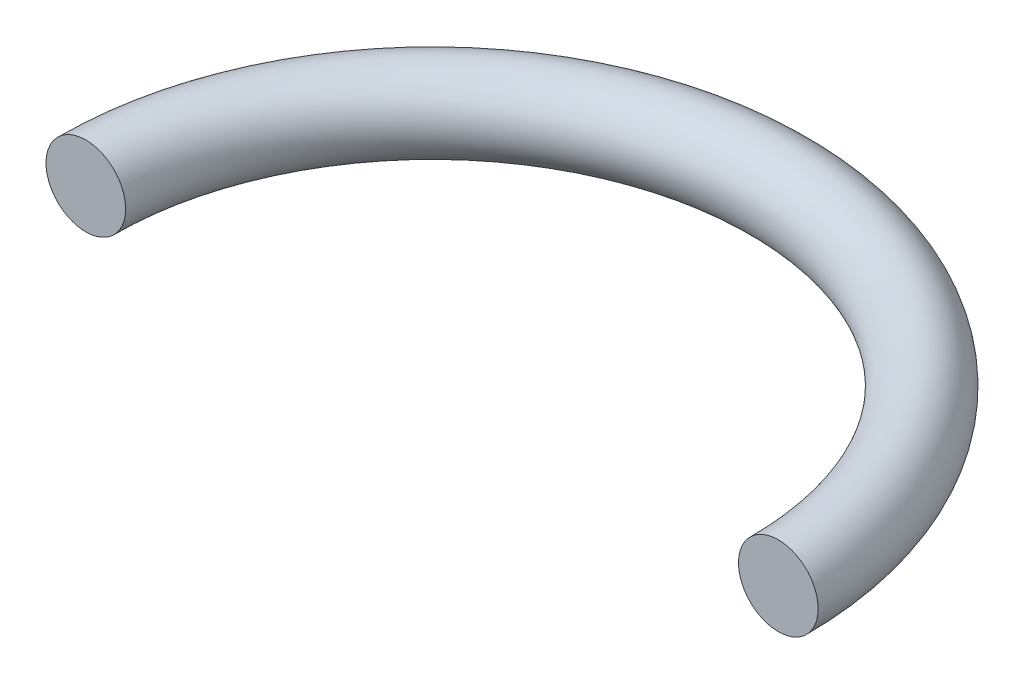
ISO-10303-21;
HEADER;
FILE_DESCRIPTION(('STEP AP214'),'2;1');
FILE_NAME('part.step','',(''),(''),'','','');
FILE_SCHEMA(('AUTOMOTIVE_DESIGN { 1 0 10303 214 1 1 1 1 }'));
ENDSEC;
DATA;
#1=APPLICATION_CONTEXT('core data for automotive mechanical design processes');
#2=APPLICATION_PROTOCOL_DEFINITION('international standard','automotive_design',2000,#1);
#3=PRODUCT_CONTEXT('',#1,'mechanical');
#4=PRODUCT('Part','Part','',(#3));
#5=PRODUCT_RELATED_PRODUCT_CATEGORY('part','',(#4));
#6=PRODUCT_DEFINITION_FORMATION('','',#4);
#7=PRODUCT_DEFINITION_CONTEXT('part definition',#1,'design');
#8=PRODUCT_DEFINITION('design','',#6,#7);
#9=PRODUCT_DEFINITION_SHAPE('','',#8);
#10=(LENGTH_UNIT() NAMED_UNIT(*) SI_UNIT(.MILLI.,.METRE.));
#11=(NAMED_UNIT(*) PLANE_ANGLE_UNIT() SI_UNIT($,.RADIAN.));
#12=(NAMED_UNIT(*) SI_UNIT($,.STERADIAN.) SOLID_ANGLE_UNIT());
#13=UNCERTAINTY_MEASURE_WITH_UNIT(LENGTH_MEASURE(1.E-05),#10,'distance_accuracy_value','');
#14=(GEOMETRIC_REPRESENTATION_CONTEXT(3) GLOBAL_UNCERTAINTY_ASSIGNED_CONTEXT((#13)) GLOBAL_UNIT_ASSIGNED_CONTEXT((#10,
#11,#12)) REPRESENTATION_CONTEXT('',''));
#15=CARTESIAN_POINT('',(0.,0.,0.));
#16=DIRECTION('',(0.,0.,1.));
#17=DIRECTION('',(1.,0.,0.));
#18=AXIS2_PLACEMENT_3D('',#15,#16,#17);
#19=CARTESIAN_POINT('',(0.,0.,0.));
#20=DIRECTION('',(0.,-1.,0.));
#21=DIRECTION('',(0.,0.,-1.));
#22=AXIS2_PLACEMENT_3D('',#19,#20,#21);
#23=TOROIDAL_SURFACE('',#22,127.,14.605);
#24=CARTESIAN_POINT('',(-127.,0.,0.));
#25=DIRECTION('',(0.,0.,-1.));
#26=DIRECTION('',(-1.,0.,0.));
#27=AXIS2_PLACEMENT_3D('',#24,#25,#26);
#28=CIRCLE('',#27,14.605);
#29=CARTESIAN_POINT('',(-141.605,0.,0.));
#30=VERTEX_POINT('',#29);
#31=EDGE_CURVE('E10',#30,#30,#28,.T.);
#32=CARTESIAN_POINT('',(127.,0.,0.));
#33=DIRECTION('',(0.,0.,1.));
#34=DIRECTION('',(1.,0.,0.));
#35=AXIS2_PLACEMENT_3D('',#32,#33,#34);
#36=CIRCLE('',#35,14.605);
#37=CARTESIAN_POINT('',(141.605,0.,0.));
#38=VERTEX_POINT('',#37);
#39=EDGE_CURVE('E36',#38,#38,#36,.T.);
#40=CARTESIAN_POINT('',(0.,0.,0.));
#41=DIRECTION('',(0.,-1.,0.));
#42=DIRECTION('',(0.,0.,-1.));
#43=AXIS2_PLACEMENT_3D('',#40,#41,#42);
#44=CIRCLE('',#43,141.605);
#45=EDGE_CURVE('',#30,#38,#44,.T.);
#46=ORIENTED_EDGE('',*,*,#31,.T.);
#47=ORIENTED_EDGE('',*,*,#39,.F.);
#48=ORIENTED_EDGE('',*,*,#45,.T.);
#49=ORIENTED_EDGE('',*,*,#45,.F.);
#50=EDGE_LOOP('',(#46,#48,#47,#49));
#51=FACE_BOUND('',#50,.T.);
#52=ADVANCED_FACE('F30',(#51),#23,.T.);
#53=CARTESIAN_POINT('',(-127.,0.,0.));
#54=DIRECTION('',(0.,0.,-1.));
#55=DIRECTION('',(-1.,0.,0.));
#56=AXIS2_PLACEMENT_3D('',#53,#54,#55);
#57=PLANE('',#56);
#58=ORIENTED_EDGE('',*,*,#31,.F.);
#59=EDGE_LOOP('',(#58));
#60=FACE_BOUND('',#59,.T.);
#61=ADVANCED_FACE('F45',(#60),#57,.F.);
#62=CARTESIAN_POINT('',(127.,0.,0.));
#63=DIRECTION('',(0.,0.,1.));
#64=DIRECTION('',(1.,0.,0.));
#65=AXIS2_PLACEMENT_3D('',#62,#63,#64);
#66=PLANE('',#65);
#67=ORIENTED_EDGE('',*,*,#39,.T.);
#68=EDGE_LOOP('',(#67));
#69=FACE_BOUND('',#68,.T.);
#70=ADVANCED_FACE('F42',(#69),#66,.T.);
#71=CLOSED_SHELL('',(#52,#61,#70));
#72=MANIFOLD_SOLID_BREP('B2',#71);
#73=ADVANCED_BREP_SHAPE_REPRESENTATION('',(#18,#72),#14);
#74=SHAPE_DEFINITION_REPRESENTATION(#9,#73);
ENDSEC;
END-ISO-10303-21;
